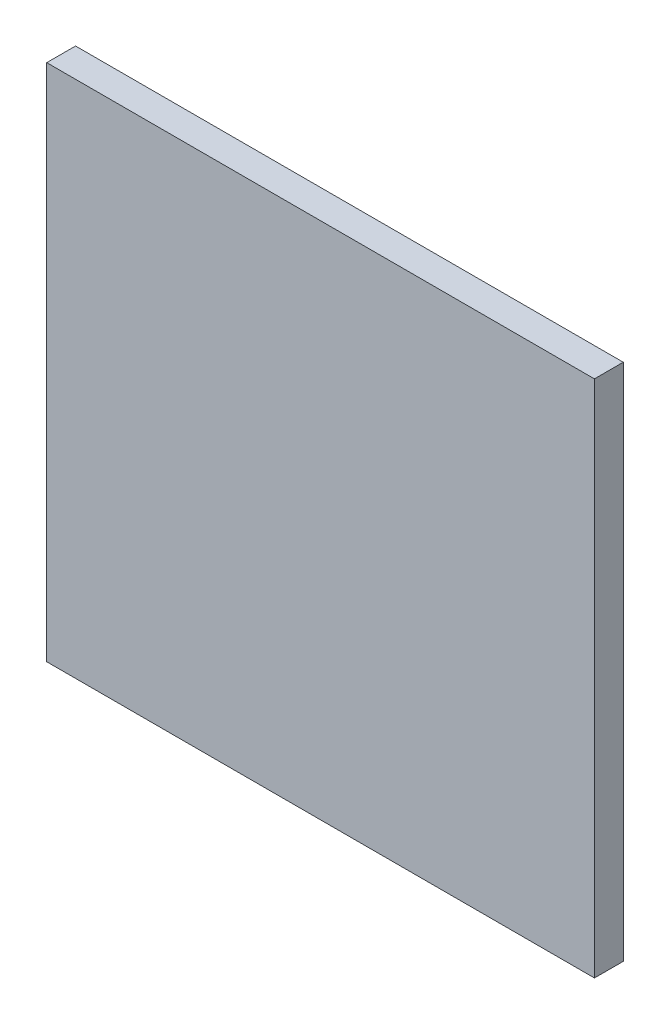
ISO-10303-21;
HEADER;
FILE_DESCRIPTION(('STEP AP214'),'2;1');
FILE_NAME('part.step','',(''),(''),'','','');
FILE_SCHEMA(('AUTOMOTIVE_DESIGN { 1 0 10303 214 1 1 1 1 }'));
ENDSEC;
DATA;
#1=APPLICATION_CONTEXT('core data for automotive mechanical design processes');
#2=APPLICATION_PROTOCOL_DEFINITION('international standard','automotive_design',2000,#1);
#3=PRODUCT_CONTEXT('',#1,'mechanical');
#4=PRODUCT('Part','Part','',(#3));
#5=PRODUCT_RELATED_PRODUCT_CATEGORY('part','',(#4));
#6=PRODUCT_DEFINITION_FORMATION('','',#4);
#7=PRODUCT_DEFINITION_CONTEXT('part definition',#1,'design');
#8=PRODUCT_DEFINITION('design','',#6,#7);
#9=PRODUCT_DEFINITION_SHAPE('','',#8);
#10=(LENGTH_UNIT() NAMED_UNIT(*) SI_UNIT(.MILLI.,.METRE.));
#11=(NAMED_UNIT(*) PLANE_ANGLE_UNIT() SI_UNIT($,.RADIAN.));
#12=(NAMED_UNIT(*) SI_UNIT($,.STERADIAN.) SOLID_ANGLE_UNIT());
#13=UNCERTAINTY_MEASURE_WITH_UNIT(LENGTH_MEASURE(1.E-05),#10,'distance_accuracy_value','');
#14=(GEOMETRIC_REPRESENTATION_CONTEXT(3) GLOBAL_UNCERTAINTY_ASSIGNED_CONTEXT((#13)) GLOBAL_UNIT_ASSIGNED_CONTEXT((#10,
#11,#12)) REPRESENTATION_CONTEXT('',''));
#15=CARTESIAN_POINT('',(0.,0.,0.));
#16=DIRECTION('',(0.,0.,1.));
#17=DIRECTION('',(1.,0.,0.));
#18=AXIS2_PLACEMENT_3D('',#15,#16,#17);
#19=CARTESIAN_POINT('',(0.,-3.6,0.));
#20=DIRECTION('',(0.,0.,1.));
#21=DIRECTION('',(1.,0.,0.));
#22=AXIS2_PLACEMENT_3D('',#19,#20,#21);
#23=PLANE('',#22);
#24=DIRECTION('',(0.,-1.,0.));
#25=VECTOR('',#24,1.);
#26=CARTESIAN_POINT('',(0.7,-3.5,0.));
#27=LINE('',#26,#25);
#28=CARTESIAN_POINT('',(0.7,-3.,0.));
#29=VERTEX_POINT('',#28);
#30=CARTESIAN_POINT('',(0.7,-3.5,0.));
#31=VERTEX_POINT('',#30);
#32=EDGE_CURVE('E263',#29,#31,#27,.T.);
#33=ORIENTED_EDGE('',*,*,#32,.F.);
#34=DIRECTION('',(1.,0.,0.));
#35=VECTOR('',#34,1.);
#36=CARTESIAN_POINT('',(0.7,-3.,0.));
#37=LINE('',#36,#35);
#38=CARTESIAN_POINT('',(0.1,-3.,0.));
#39=VERTEX_POINT('',#38);
#40=EDGE_CURVE('E276',#39,#29,#37,.T.);
#41=ORIENTED_EDGE('',*,*,#40,.F.);
#42=DIRECTION('',(0.,1.,0.));
#43=VECTOR('',#42,1.);
#44=CARTESIAN_POINT('',(0.1,-3.5,0.));
#45=LINE('',#44,#43);
#46=CARTESIAN_POINT('',(0.1,-3.5,0.));
#47=VERTEX_POINT('',#46);
#48=EDGE_CURVE('E285',#47,#39,#45,.T.);
#49=ORIENTED_EDGE('',*,*,#48,.F.);
#50=DIRECTION('',(-1.,0.,0.));
#51=VECTOR('',#50,1.);
#52=CARTESIAN_POINT('',(0.7,-3.5,0.));
#53=LINE('',#52,#51);
#54=EDGE_CURVE('E266',#31,#47,#53,.T.);
#55=ORIENTED_EDGE('',*,*,#54,.F.);
#56=EDGE_LOOP('',(#33,#41,#49,#55));
#57=FACE_BOUND('',#56,.T.);
#58=DIRECTION('',(0.,-1.,0.));
#59=VECTOR('',#58,1.);
#60=CARTESIAN_POINT('',(3.7,-0.6,0.));
#61=LINE('',#60,#59);
#62=CARTESIAN_POINT('',(3.7,-0.0999999999999994,0.));
#63=VERTEX_POINT('',#62);
#64=CARTESIAN_POINT('',(3.7,-0.6,0.));
#65=VERTEX_POINT('',#64);
#66=EDGE_CURVE('E334',#63,#65,#61,.T.);
#67=ORIENTED_EDGE('',*,*,#66,.F.);
#68=DIRECTION('',(1.,0.,0.));
#69=VECTOR('',#68,1.);
#70=CARTESIAN_POINT('',(3.7,-0.0999999999999994,0.));
#71=LINE('',#70,#69);
#72=CARTESIAN_POINT('',(3.1,-0.0999999999999998,0.));
#73=VERTEX_POINT('',#72);
#74=EDGE_CURVE('E339',#73,#63,#71,.T.);
#75=ORIENTED_EDGE('',*,*,#74,.F.);
#76=DIRECTION('',(0.,1.,0.));
#77=VECTOR('',#76,1.);
#78=CARTESIAN_POINT('',(3.1,-0.599999999999999,0.));
#79=LINE('',#78,#77);
#80=CARTESIAN_POINT('',(3.1,-0.599999999999999,0.));
#81=VERTEX_POINT('',#80);
#82=EDGE_CURVE('E351',#81,#73,#79,.T.);
#83=ORIENTED_EDGE('',*,*,#82,.F.);
#84=DIRECTION('',(-1.,0.,0.));
#85=VECTOR('',#84,1.);
#86=CARTESIAN_POINT('',(3.7,-0.6,0.));
#87=LINE('',#86,#85);
#88=EDGE_CURVE('E348',#65,#81,#87,.T.);
#89=ORIENTED_EDGE('',*,*,#88,.F.);
#90=EDGE_LOOP('',(#67,#75,#83,#89));
#91=FACE_BOUND('',#90,.T.);
#92=DIRECTION('',(0.,-1.,0.));
#93=VECTOR('',#92,1.);
#94=CARTESIAN_POINT('',(3.7,-3.,0.));
#95=LINE('',#94,#93);
#96=CARTESIAN_POINT('',(3.7,-3.,0.));
#97=VERTEX_POINT('',#96);
#98=CARTESIAN_POINT('',(3.7,-3.5,0.));
#99=VERTEX_POINT('',#98);
#100=EDGE_CURVE('E400',#97,#99,#95,.T.);
#101=ORIENTED_EDGE('',*,*,#100,.F.);
#102=DIRECTION('',(1.,0.,0.));
#103=VECTOR('',#102,1.);
#104=CARTESIAN_POINT('',(3.7,-3.,0.));
#105=LINE('',#104,#103);
#106=CARTESIAN_POINT('',(3.1,-3.,0.));
#107=VERTEX_POINT('',#106);
#108=EDGE_CURVE('E405',#107,#97,#105,.T.);
#109=ORIENTED_EDGE('',*,*,#108,.F.);
#110=DIRECTION('',(0.,1.,0.));
#111=VECTOR('',#110,1.);
#112=CARTESIAN_POINT('',(3.1,-3.,0.));
#113=LINE('',#112,#111);
#114=CARTESIAN_POINT('',(3.1,-3.5,0.));
#115=VERTEX_POINT('',#114);
#116=EDGE_CURVE('E417',#115,#107,#113,.T.);
#117=ORIENTED_EDGE('',*,*,#116,.F.);
#118=DIRECTION('',(-1.,0.,0.));
#119=VECTOR('',#118,1.);
#120=CARTESIAN_POINT('',(3.7,-3.5,0.));
#121=LINE('',#120,#119);
#122=EDGE_CURVE('E414',#99,#115,#121,.T.);
#123=ORIENTED_EDGE('',*,*,#122,.F.);
#124=EDGE_LOOP('',(#101,#109,#117,#123));
#125=FACE_BOUND('',#124,.T.);
#126=DIRECTION('',(0.,-1.,0.));
#127=VECTOR('',#126,1.);
#128=CARTESIAN_POINT('',(0.,0.,0.));
#129=LINE('',#128,#127);
#130=CARTESIAN_POINT('',(0.,0.,0.));
#131=VERTEX_POINT('',#130);
#132=CARTESIAN_POINT('',(0.,-3.6,0.));
#133=VERTEX_POINT('',#132);
#134=EDGE_CURVE('E466',#131,#133,#129,.T.);
#135=ORIENTED_EDGE('',*,*,#134,.F.);
#136=DIRECTION('',(-1.,0.,0.));
#137=VECTOR('',#136,1.);
#138=CARTESIAN_POINT('',(0.,0.,0.));
#139=LINE('',#138,#137);
#140=CARTESIAN_POINT('',(3.8,0.,0.));
#141=VERTEX_POINT('',#140);
#142=EDGE_CURVE('E471',#141,#131,#139,.T.);
#143=ORIENTED_EDGE('',*,*,#142,.F.);
#144=DIRECTION('',(0.,1.,0.));
#145=VECTOR('',#144,1.);
#146=CARTESIAN_POINT('',(3.8,0.,0.));
#147=LINE('',#146,#145);
#148=CARTESIAN_POINT('',(3.8,-3.6,0.));
#149=VERTEX_POINT('',#148);
#150=EDGE_CURVE('E482',#149,#141,#147,.T.);
#151=ORIENTED_EDGE('',*,*,#150,.F.);
#152=DIRECTION('',(1.,0.,0.));
#153=VECTOR('',#152,1.);
#154=CARTESIAN_POINT('',(0.,-3.6,0.));
#155=LINE('',#154,#153);
#156=EDGE_CURVE('E480',#133,#149,#155,.T.);
#157=ORIENTED_EDGE('',*,*,#156,.F.);
#158=EDGE_LOOP('',(#135,#143,#151,#157));
#159=FACE_BOUND('',#158,.T.);
#160=DIRECTION('',(0.,-1.,0.));
#161=VECTOR('',#160,1.);
#162=CARTESIAN_POINT('',(0.65,-1.5,0.));
#163=LINE('',#162,#161);
#164=CARTESIAN_POINT('',(0.65,-1.5,0.));
#165=VERTEX_POINT('',#164);
#166=CARTESIAN_POINT('',(0.65,-2.1,0.));
#167=VERTEX_POINT('',#166);
#168=EDGE_CURVE('E433',#165,#167,#163,.T.);
#169=ORIENTED_EDGE('',*,*,#168,.F.);
#170=DIRECTION('',(1.,0.,0.));
#171=VECTOR('',#170,1.);
#172=CARTESIAN_POINT('',(0.65,-1.5,0.));
#173=LINE('',#172,#171);
#174=CARTESIAN_POINT('',(0.15,-1.5,0.));
#175=VERTEX_POINT('',#174);
#176=EDGE_CURVE('E438',#175,#165,#173,.T.);
#177=ORIENTED_EDGE('',*,*,#176,.F.);
#178=DIRECTION('',(0.,1.,0.));
#179=VECTOR('',#178,1.);
#180=CARTESIAN_POINT('',(0.15,-1.5,0.));
#181=LINE('',#180,#179);
#182=CARTESIAN_POINT('',(0.15,-2.1,0.));
#183=VERTEX_POINT('',#182);
#184=EDGE_CURVE('E450',#183,#175,#181,.T.);
#185=ORIENTED_EDGE('',*,*,#184,.F.);
#186=DIRECTION('',(-1.,0.,0.));
#187=VECTOR('',#186,1.);
#188=CARTESIAN_POINT('',(0.65,-2.1,0.));
#189=LINE('',#188,#187);
#190=EDGE_CURVE('E447',#167,#183,#189,.T.);
#191=ORIENTED_EDGE('',*,*,#190,.F.);
#192=EDGE_LOOP('',(#169,#177,#185,#191));
#193=FACE_BOUND('',#192,.T.);
#194=DIRECTION('',(0.,-1.,0.));
#195=VECTOR('',#194,1.);
#196=CARTESIAN_POINT('',(2.2,-3.5,0.));
#197=LINE('',#196,#195);
#198=CARTESIAN_POINT('',(2.2,-3.,0.));
#199=VERTEX_POINT('',#198);
#200=CARTESIAN_POINT('',(2.2,-3.5,0.));
#201=VERTEX_POINT('',#200);
#202=EDGE_CURVE('E367',#199,#201,#197,.T.);
#203=ORIENTED_EDGE('',*,*,#202,.F.);
#204=DIRECTION('',(1.,0.,0.));
#205=VECTOR('',#204,1.);
#206=CARTESIAN_POINT('',(2.2,-3.,0.));
#207=LINE('',#206,#205);
#208=CARTESIAN_POINT('',(1.6,-3.,0.));
#209=VERTEX_POINT('',#208);
#210=EDGE_CURVE('E372',#209,#199,#207,.T.);
#211=ORIENTED_EDGE('',*,*,#210,.F.);
#212=DIRECTION('',(0.,1.,0.));
#213=VECTOR('',#212,1.);
#214=CARTESIAN_POINT('',(1.6,-3.5,0.));
#215=LINE('',#214,#213);
#216=CARTESIAN_POINT('',(1.6,-3.5,0.));
#217=VERTEX_POINT('',#216);
#218=EDGE_CURVE('E384',#217,#209,#215,.T.);
#219=ORIENTED_EDGE('',*,*,#218,.F.);
#220=DIRECTION('',(-1.,0.,0.));
#221=VECTOR('',#220,1.);
#222=CARTESIAN_POINT('',(2.2,-3.5,0.));
#223=LINE('',#222,#221);
#224=EDGE_CURVE('E381',#201,#217,#223,.T.);
#225=ORIENTED_EDGE('',*,*,#224,.F.);
#226=EDGE_LOOP('',(#203,#211,#219,#225));
#227=FACE_BOUND('',#226,.T.);
#228=DIRECTION('',(0.,-1.,0.));
#229=VECTOR('',#228,1.);
#230=CARTESIAN_POINT('',(2.2,-0.6,0.));
#231=LINE('',#230,#229);
#232=CARTESIAN_POINT('',(2.2,-0.0999999999999995,0.));
#233=VERTEX_POINT('',#232);
#234=CARTESIAN_POINT('',(2.2,-0.6,0.));
#235=VERTEX_POINT('',#234);
#236=EDGE_CURVE('E301',#233,#235,#231,.T.);
#237=ORIENTED_EDGE('',*,*,#236,.F.);
#238=DIRECTION('',(1.,0.,0.));
#239=VECTOR('',#238,1.);
#240=CARTESIAN_POINT('',(2.2,-0.0999999999999995,0.));
#241=LINE('',#240,#239);
#242=CARTESIAN_POINT('',(1.6,-0.1,0.));
#243=VERTEX_POINT('',#242);
#244=EDGE_CURVE('E306',#243,#233,#241,.T.);
#245=ORIENTED_EDGE('',*,*,#244,.F.);
#246=DIRECTION('',(0.,1.,0.));
#247=VECTOR('',#246,1.);
#248=CARTESIAN_POINT('',(1.6,-0.599999999999999,0.));
#249=LINE('',#248,#247);
#250=CARTESIAN_POINT('',(1.6,-0.599999999999999,0.));
#251=VERTEX_POINT('',#250);
#252=EDGE_CURVE('E318',#251,#243,#249,.T.);
#253=ORIENTED_EDGE('',*,*,#252,.F.);
#254=DIRECTION('',(-1.,0.,0.));
#255=VECTOR('',#254,1.);
#256=CARTESIAN_POINT('',(2.2,-0.6,0.));
#257=LINE('',#256,#255);
#258=EDGE_CURVE('E315',#235,#251,#257,.T.);
#259=ORIENTED_EDGE('',*,*,#258,.F.);
#260=EDGE_LOOP('',(#237,#245,#253,#259));
#261=FACE_BOUND('',#260,.T.);
#262=DIRECTION('',(0.,-1.,0.));
#263=VECTOR('',#262,1.);
#264=CARTESIAN_POINT('',(0.7,-0.6,0.));
#265=LINE('',#264,#263);
#266=CARTESIAN_POINT('',(0.7,-0.0999999999999994,0.));
#267=VERTEX_POINT('',#266);
#268=CARTESIAN_POINT('',(0.7,-0.6,0.));
#269=VERTEX_POINT('',#268);
#270=EDGE_CURVE('E262',#267,#269,#265,.T.);
#271=ORIENTED_EDGE('',*,*,#270,.F.);
#272=DIRECTION('',(1.,0.,0.));
#273=VECTOR('',#272,1.);
#274=CARTESIAN_POINT('',(0.7,-0.0999999999999994,0.));
#275=LINE('',#274,#273);
#276=CARTESIAN_POINT('',(0.100000000000001,-0.0999999999999994,0.));
#277=VERTEX_POINT('',#276);
#278=EDGE_CURVE('E259',#277,#267,#275,.T.);
#279=ORIENTED_EDGE('',*,*,#278,.F.);
#280=DIRECTION('',(0.,1.,0.));
#281=VECTOR('',#280,1.);
#282=CARTESIAN_POINT('',(0.100000000000001,-0.6,0.));
#283=LINE('',#282,#281);
#284=CARTESIAN_POINT('',(0.100000000000001,-0.6,0.));
#285=VERTEX_POINT('',#284);
#286=EDGE_CURVE('E53',#285,#277,#283,.T.);
#287=ORIENTED_EDGE('',*,*,#286,.F.);
#288=DIRECTION('',(-1.,0.,0.));
#289=VECTOR('',#288,1.);
#290=CARTESIAN_POINT('',(0.7,-0.6,0.));
#291=LINE('',#290,#289);
#292=EDGE_CURVE('E48',#269,#285,#291,.T.);
#293=ORIENTED_EDGE('',*,*,#292,.F.);
#294=EDGE_LOOP('',(#271,#279,#287,#293));
#295=FACE_BOUND('',#294,.T.);
#296=ADVANCED_FACE('F33',(#57,#91,#125,#159,#193,#227,#261,#295),#23,.F.);
#297=CARTESIAN_POINT('',(0.,0.,0.2));
#298=DIRECTION('',(1.,0.,0.));
#299=DIRECTION('',(0.,1.,0.));
#300=AXIS2_PLACEMENT_3D('',#297,#298,#299);
#301=PLANE('',#300);
#302=ORIENTED_EDGE('',*,*,#134,.T.);
#303=DIRECTION('',(0.,0.,-1.));
#304=VECTOR('',#303,1.);
#305=CARTESIAN_POINT('',(0.,-3.6,0.2));
#306=LINE('',#305,#304);
#307=CARTESIAN_POINT('',(0.,-3.6,0.2));
#308=VERTEX_POINT('',#307);
#309=EDGE_CURVE('E11',#308,#133,#306,.T.);
#310=ORIENTED_EDGE('',*,*,#309,.F.);
#311=DIRECTION('',(0.,-1.,0.));
#312=VECTOR('',#311,1.);
#313=CARTESIAN_POINT('',(0.,0.,0.2));
#314=LINE('',#313,#312);
#315=CARTESIAN_POINT('',(0.,0.,0.2));
#316=VERTEX_POINT('',#315);
#317=EDGE_CURVE('E467',#316,#308,#314,.T.);
#318=ORIENTED_EDGE('',*,*,#317,.F.);
#319=DIRECTION('',(0.,0.,-1.));
#320=VECTOR('',#319,1.);
#321=CARTESIAN_POINT('',(0.,0.,0.2));
#322=LINE('',#321,#320);
#323=EDGE_CURVE('E477',#316,#131,#322,.T.);
#324=ORIENTED_EDGE('',*,*,#323,.T.);
#325=EDGE_LOOP('',(#302,#310,#318,#324));
#326=FACE_BOUND('',#325,.T.);
#327=ADVANCED_FACE('F35',(#326),#301,.F.);
#328=CARTESIAN_POINT('',(0.,-3.6,0.2));
#329=DIRECTION('',(0.,1.,0.));
#330=DIRECTION('',(0.,0.,1.));
#331=AXIS2_PLACEMENT_3D('',#328,#329,#330);
#332=PLANE('',#331);
#333=ORIENTED_EDGE('',*,*,#156,.T.);
#334=DIRECTION('',(0.,0.,-1.));
#335=VECTOR('',#334,1.);
#336=CARTESIAN_POINT('',(3.8,-3.6,0.2));
#337=LINE('',#336,#335);
#338=CARTESIAN_POINT('',(3.8,-3.6,0.2));
#339=VERTEX_POINT('',#338);
#340=EDGE_CURVE('E41',#339,#149,#337,.T.);
#341=ORIENTED_EDGE('',*,*,#340,.F.);
#342=DIRECTION('',(1.,0.,0.));
#343=VECTOR('',#342,1.);
#344=CARTESIAN_POINT('',(0.,-3.6,0.2));
#345=LINE('',#344,#343);
#346=EDGE_CURVE('E470',#308,#339,#345,.T.);
#347=ORIENTED_EDGE('',*,*,#346,.F.);
#348=ORIENTED_EDGE('',*,*,#309,.T.);
#349=EDGE_LOOP('',(#333,#341,#347,#348));
#350=FACE_BOUND('',#349,.T.);
#351=ADVANCED_FACE('F510',(#350),#332,.F.);
#352=CARTESIAN_POINT('',(3.8,0.,0.2));
#353=DIRECTION('',(-1.,0.,0.));
#354=DIRECTION('',(0.,-1.,0.));
#355=AXIS2_PLACEMENT_3D('',#352,#353,#354);
#356=PLANE('',#355);
#357=ORIENTED_EDGE('',*,*,#150,.T.);
#358=DIRECTION('',(0.,0.,-1.));
#359=VECTOR('',#358,1.);
#360=CARTESIAN_POINT('',(3.8,0.,0.2));
#361=LINE('',#360,#359);
#362=CARTESIAN_POINT('',(3.8,0.,0.2));
#363=VERTEX_POINT('',#362);
#364=EDGE_CURVE('E487',#363,#141,#361,.T.);
#365=ORIENTED_EDGE('',*,*,#364,.F.);
#366=DIRECTION('',(0.,1.,0.));
#367=VECTOR('',#366,1.);
#368=CARTESIAN_POINT('',(3.8,0.,0.2));
#369=LINE('',#368,#367);
#370=EDGE_CURVE('E473',#339,#363,#369,.T.);
#371=ORIENTED_EDGE('',*,*,#370,.F.);
#372=ORIENTED_EDGE('',*,*,#340,.T.);
#373=EDGE_LOOP('',(#357,#365,#371,#372));
#374=FACE_BOUND('',#373,.T.);
#375=ADVANCED_FACE('F494',(#374),#356,.F.);
#376=CARTESIAN_POINT('',(0.,0.,0.2));
#377=DIRECTION('',(0.,-1.,0.));
#378=DIRECTION('',(0.,0.,-1.));
#379=AXIS2_PLACEMENT_3D('',#376,#377,#378);
#380=PLANE('',#379);
#381=ORIENTED_EDGE('',*,*,#142,.T.);
#382=ORIENTED_EDGE('',*,*,#323,.F.);
#383=DIRECTION('',(-1.,0.,0.));
#384=VECTOR('',#383,1.);
#385=CARTESIAN_POINT('',(0.,0.,0.2));
#386=LINE('',#385,#384);
#387=EDGE_CURVE('E475',#363,#316,#386,.T.);
#388=ORIENTED_EDGE('',*,*,#387,.F.);
#389=ORIENTED_EDGE('',*,*,#364,.T.);
#390=EDGE_LOOP('',(#381,#382,#388,#389));
#391=FACE_BOUND('',#390,.T.);
#392=ADVANCED_FACE('F503',(#391),#380,.F.);
#393=CARTESIAN_POINT('',(0.,-3.6,0.2));
#394=DIRECTION('',(0.,0.,1.));
#395=DIRECTION('',(1.,0.,0.));
#396=AXIS2_PLACEMENT_3D('',#393,#394,#395);
#397=PLANE('',#396);
#398=ORIENTED_EDGE('',*,*,#317,.T.);
#399=ORIENTED_EDGE('',*,*,#346,.T.);
#400=ORIENTED_EDGE('',*,*,#370,.T.);
#401=ORIENTED_EDGE('',*,*,#387,.T.);
#402=EDGE_LOOP('',(#398,#399,#400,#401));
#403=FACE_BOUND('',#402,.T.);
#404=ADVANCED_FACE('F509',(#403),#397,.T.);
#405=CARTESIAN_POINT('',(0.65,-1.5,-0.006));
#406=DIRECTION('',(-1.,0.,0.));
#407=DIRECTION('',(0.,0.,1.));
#408=AXIS2_PLACEMENT_3D('',#405,#406,#407);
#409=PLANE('',#408);
#410=ORIENTED_EDGE('',*,*,#168,.T.);
#411=DIRECTION('',(0.,0.,1.));
#412=VECTOR('',#411,1.);
#413=CARTESIAN_POINT('',(0.65,-2.1,-0.006));
#414=LINE('',#413,#412);
#415=CARTESIAN_POINT('',(0.65,-2.1,-0.006));
#416=VERTEX_POINT('',#415);
#417=EDGE_CURVE('E463',#416,#167,#414,.T.);
#418=ORIENTED_EDGE('',*,*,#417,.F.);
#419=DIRECTION('',(0.,-1.,0.));
#420=VECTOR('',#419,1.);
#421=CARTESIAN_POINT('',(0.65,-1.5,-0.006));
#422=LINE('',#421,#420);
#423=CARTESIAN_POINT('',(0.65,-1.5,-0.006));
#424=VERTEX_POINT('',#423);
#425=EDGE_CURVE('E434',#424,#416,#422,.T.);
#426=ORIENTED_EDGE('',*,*,#425,.F.);
#427=DIRECTION('',(0.,0.,1.));
#428=VECTOR('',#427,1.);
#429=CARTESIAN_POINT('',(0.65,-1.5,-0.006));
#430=LINE('',#429,#428);
#431=EDGE_CURVE('E444',#424,#165,#430,.T.);
#432=ORIENTED_EDGE('',*,*,#431,.T.);
#433=EDGE_LOOP('',(#410,#418,#426,#432));
#434=FACE_BOUND('',#433,.T.);
#435=ADVANCED_FACE('F530',(#434),#409,.F.);
#436=CARTESIAN_POINT('',(0.65,-2.1,-0.006));
#437=DIRECTION('',(0.,1.,0.));
#438=DIRECTION('',(-1.,0.,0.));
#439=AXIS2_PLACEMENT_3D('',#436,#437,#438);
#440=PLANE('',#439);
#441=ORIENTED_EDGE('',*,*,#190,.T.);
#442=DIRECTION('',(0.,0.,1.));
#443=VECTOR('',#442,1.);
#444=CARTESIAN_POINT('',(0.15,-2.1,-0.006));
#445=LINE('',#444,#443);
#446=CARTESIAN_POINT('',(0.15,-2.1,-0.006));
#447=VERTEX_POINT('',#446);
#448=EDGE_CURVE('E460',#447,#183,#445,.T.);
#449=ORIENTED_EDGE('',*,*,#448,.F.);
#450=DIRECTION('',(-1.,0.,0.));
#451=VECTOR('',#450,1.);
#452=CARTESIAN_POINT('',(0.65,-2.1,-0.006));
#453=LINE('',#452,#451);
#454=EDGE_CURVE('E437',#416,#447,#453,.T.);
#455=ORIENTED_EDGE('',*,*,#454,.F.);
#456=ORIENTED_EDGE('',*,*,#417,.T.);
#457=EDGE_LOOP('',(#441,#449,#455,#456));
#458=FACE_BOUND('',#457,.T.);
#459=ADVANCED_FACE('F534',(#458),#440,.F.);
#460=CARTESIAN_POINT('',(0.15,-1.5,-0.006));
#461=DIRECTION('',(1.,0.,0.));
#462=DIRECTION('',(0.,0.,-1.));
#463=AXIS2_PLACEMENT_3D('',#460,#461,#462);
#464=PLANE('',#463);
#465=ORIENTED_EDGE('',*,*,#184,.T.);
#466=DIRECTION('',(0.,0.,1.));
#467=VECTOR('',#466,1.);
#468=CARTESIAN_POINT('',(0.15,-1.5,-0.006));
#469=LINE('',#468,#467);
#470=CARTESIAN_POINT('',(0.15,-1.5,-0.006));
#471=VERTEX_POINT('',#470);
#472=EDGE_CURVE('E457',#471,#175,#469,.T.);
#473=ORIENTED_EDGE('',*,*,#472,.F.);
#474=DIRECTION('',(0.,1.,0.));
#475=VECTOR('',#474,1.);
#476=CARTESIAN_POINT('',(0.15,-1.5,-0.006));
#477=LINE('',#476,#475);
#478=EDGE_CURVE('E440',#447,#471,#477,.T.);
#479=ORIENTED_EDGE('',*,*,#478,.F.);
#480=ORIENTED_EDGE('',*,*,#448,.T.);
#481=EDGE_LOOP('',(#465,#473,#479,#480));
#482=FACE_BOUND('',#481,.T.);
#483=ADVANCED_FACE('F539',(#482),#464,.F.);
#484=CARTESIAN_POINT('',(0.65,-1.5,-0.006));
#485=DIRECTION('',(0.,-1.,0.));
#486=DIRECTION('',(0.,0.,-1.));
#487=AXIS2_PLACEMENT_3D('',#484,#485,#486);
#488=PLANE('',#487);
#489=ORIENTED_EDGE('',*,*,#176,.T.);
#490=ORIENTED_EDGE('',*,*,#431,.F.);
#491=DIRECTION('',(1.,0.,0.));
#492=VECTOR('',#491,1.);
#493=CARTESIAN_POINT('',(0.65,-1.5,-0.006));
#494=LINE('',#493,#492);
#495=EDGE_CURVE('E442',#471,#424,#494,.T.);
#496=ORIENTED_EDGE('',*,*,#495,.F.);
#497=ORIENTED_EDGE('',*,*,#472,.T.);
#498=EDGE_LOOP('',(#489,#490,#496,#497));
#499=FACE_BOUND('',#498,.T.);
#500=ADVANCED_FACE('F545',(#499),#488,.F.);
#501=CARTESIAN_POINT('',(0.65,-2.1,-0.006));
#502=DIRECTION('',(0.,0.,-1.));
#503=DIRECTION('',(-1.,0.,0.));
#504=AXIS2_PLACEMENT_3D('',#501,#502,#503);
#505=PLANE('',#504);
#506=ORIENTED_EDGE('',*,*,#425,.T.);
#507=ORIENTED_EDGE('',*,*,#454,.T.);
#508=ORIENTED_EDGE('',*,*,#478,.T.);
#509=ORIENTED_EDGE('',*,*,#495,.T.);
#510=EDGE_LOOP('',(#506,#507,#508,#509));
#511=FACE_BOUND('',#510,.T.);
#512=ADVANCED_FACE('F549',(#511),#505,.T.);
#513=CARTESIAN_POINT('',(3.7,-3.,-0.006));
#514=DIRECTION('',(-1.,0.,0.));
#515=DIRECTION('',(0.,0.,1.));
#516=AXIS2_PLACEMENT_3D('',#513,#514,#515);
#517=PLANE('',#516);
#518=ORIENTED_EDGE('',*,*,#100,.T.);
#519=DIRECTION('',(0.,0.,1.));
#520=VECTOR('',#519,1.);
#521=CARTESIAN_POINT('',(3.7,-3.5,-0.006));
#522=LINE('',#521,#520);
#523=CARTESIAN_POINT('',(3.7,-3.5,-0.006));
#524=VERTEX_POINT('',#523);
#525=EDGE_CURVE('E430',#524,#99,#522,.T.);
#526=ORIENTED_EDGE('',*,*,#525,.F.);
#527=DIRECTION('',(0.,-1.,0.));
#528=VECTOR('',#527,1.);
#529=CARTESIAN_POINT('',(3.7,-3.,-0.006));
#530=LINE('',#529,#528);
#531=CARTESIAN_POINT('',(3.7,-3.,-0.006));
#532=VERTEX_POINT('',#531);
#533=EDGE_CURVE('E401',#532,#524,#530,.T.);
#534=ORIENTED_EDGE('',*,*,#533,.F.);
#535=DIRECTION('',(0.,0.,1.));
#536=VECTOR('',#535,1.);
#537=CARTESIAN_POINT('',(3.7,-3.,-0.006));
#538=LINE('',#537,#536);
#539=EDGE_CURVE('E411',#532,#97,#538,.T.);
#540=ORIENTED_EDGE('',*,*,#539,.T.);
#541=EDGE_LOOP('',(#518,#526,#534,#540));
#542=FACE_BOUND('',#541,.T.);
#543=ADVANCED_FACE('F553',(#542),#517,.F.);
#544=CARTESIAN_POINT('',(3.7,-3.5,-0.006));
#545=DIRECTION('',(0.,1.,0.));
#546=DIRECTION('',(0.,0.,1.));
#547=AXIS2_PLACEMENT_3D('',#544,#545,#546);
#548=PLANE('',#547);
#549=ORIENTED_EDGE('',*,*,#122,.T.);
#550=DIRECTION('',(0.,0.,1.));
#551=VECTOR('',#550,1.);
#552=CARTESIAN_POINT('',(3.1,-3.5,-0.006));
#553=LINE('',#552,#551);
#554=CARTESIAN_POINT('',(3.1,-3.5,-0.006));
#555=VERTEX_POINT('',#554);
#556=EDGE_CURVE('E427',#555,#115,#553,.T.);
#557=ORIENTED_EDGE('',*,*,#556,.F.);
#558=DIRECTION('',(-1.,0.,0.));
#559=VECTOR('',#558,1.);
#560=CARTESIAN_POINT('',(3.7,-3.5,-0.006));
#561=LINE('',#560,#559);
#562=EDGE_CURVE('E404',#524,#555,#561,.T.);
#563=ORIENTED_EDGE('',*,*,#562,.F.);
#564=ORIENTED_EDGE('',*,*,#525,.T.);
#565=EDGE_LOOP('',(#549,#557,#563,#564));
#566=FACE_BOUND('',#565,.T.);
#567=ADVANCED_FACE('F557',(#566),#548,.F.);
#568=CARTESIAN_POINT('',(3.1,-3.,-0.006));
#569=DIRECTION('',(1.,0.,0.));
#570=DIRECTION('',(0.,0.,-1.));
#571=AXIS2_PLACEMENT_3D('',#568,#569,#570);
#572=PLANE('',#571);
#573=ORIENTED_EDGE('',*,*,#116,.T.);
#574=DIRECTION('',(0.,0.,1.));
#575=VECTOR('',#574,1.);
#576=CARTESIAN_POINT('',(3.1,-3.,-0.006));
#577=LINE('',#576,#575);
#578=CARTESIAN_POINT('',(3.1,-3.,-0.006));
#579=VERTEX_POINT('',#578);
#580=EDGE_CURVE('E424',#579,#107,#577,.T.);
#581=ORIENTED_EDGE('',*,*,#580,.F.);
#582=DIRECTION('',(0.,1.,0.));
#583=VECTOR('',#582,1.);
#584=CARTESIAN_POINT('',(3.1,-3.,-0.006));
#585=LINE('',#584,#583);
#586=EDGE_CURVE('E407',#555,#579,#585,.T.);
#587=ORIENTED_EDGE('',*,*,#586,.F.);
#588=ORIENTED_EDGE('',*,*,#556,.T.);
#589=EDGE_LOOP('',(#573,#581,#587,#588));
#590=FACE_BOUND('',#589,.T.);
#591=ADVANCED_FACE('F561',(#590),#572,.F.);
#592=CARTESIAN_POINT('',(3.7,-3.,-0.006));
#593=DIRECTION('',(0.,-1.,0.));
#594=DIRECTION('',(1.,0.,0.));
#595=AXIS2_PLACEMENT_3D('',#592,#593,#594);
#596=PLANE('',#595);
#597=ORIENTED_EDGE('',*,*,#108,.T.);
#598=ORIENTED_EDGE('',*,*,#539,.F.);
#599=DIRECTION('',(1.,0.,0.));
#600=VECTOR('',#599,1.);
#601=CARTESIAN_POINT('',(3.7,-3.,-0.006));
#602=LINE('',#601,#600);
#603=EDGE_CURVE('E409',#579,#532,#602,.T.);
#604=ORIENTED_EDGE('',*,*,#603,.F.);
#605=ORIENTED_EDGE('',*,*,#580,.T.);
#606=EDGE_LOOP('',(#597,#598,#604,#605));
#607=FACE_BOUND('',#606,.T.);
#608=ADVANCED_FACE('F565',(#607),#596,.F.);
#609=CARTESIAN_POINT('',(3.7,-3.5,-0.006));
#610=DIRECTION('',(0.,0.,-1.));
#611=DIRECTION('',(-1.,0.,0.));
#612=AXIS2_PLACEMENT_3D('',#609,#610,#611);
#613=PLANE('',#612);
#614=ORIENTED_EDGE('',*,*,#533,.T.);
#615=ORIENTED_EDGE('',*,*,#562,.T.);
#616=ORIENTED_EDGE('',*,*,#586,.T.);
#617=ORIENTED_EDGE('',*,*,#603,.T.);
#618=EDGE_LOOP('',(#614,#615,#616,#617));
#619=FACE_BOUND('',#618,.T.);
#620=ADVANCED_FACE('F569',(#619),#613,.T.);
#621=CARTESIAN_POINT('',(2.2,-3.5,-0.006));
#622=DIRECTION('',(-1.,0.,0.));
#623=DIRECTION('',(0.,0.,1.));
#624=AXIS2_PLACEMENT_3D('',#621,#622,#623);
#625=PLANE('',#624);
#626=ORIENTED_EDGE('',*,*,#202,.T.);
#627=DIRECTION('',(0.,0.,1.));
#628=VECTOR('',#627,1.);
#629=CARTESIAN_POINT('',(2.2,-3.5,-0.006));
#630=LINE('',#629,#628);
#631=CARTESIAN_POINT('',(2.2,-3.5,-0.006));
#632=VERTEX_POINT('',#631);
#633=EDGE_CURVE('E397',#632,#201,#630,.T.);
#634=ORIENTED_EDGE('',*,*,#633,.F.);
#635=DIRECTION('',(0.,-1.,0.));
#636=VECTOR('',#635,1.);
#637=CARTESIAN_POINT('',(2.2,-3.5,-0.006));
#638=LINE('',#637,#636);
#639=CARTESIAN_POINT('',(2.2,-3.,-0.006));
#640=VERTEX_POINT('',#639);
#641=EDGE_CURVE('E368',#640,#632,#638,.T.);
#642=ORIENTED_EDGE('',*,*,#641,.F.);
#643=DIRECTION('',(0.,0.,1.));
#644=VECTOR('',#643,1.);
#645=CARTESIAN_POINT('',(2.2,-3.,-0.006));
#646=LINE('',#645,#644);
#647=EDGE_CURVE('E378',#640,#199,#646,.T.);
#648=ORIENTED_EDGE('',*,*,#647,.T.);
#649=EDGE_LOOP('',(#626,#634,#642,#648));
#650=FACE_BOUND('',#649,.T.);
#651=ADVANCED_FACE('F573',(#650),#625,.F.);
#652=CARTESIAN_POINT('',(2.2,-3.5,-0.006));
#653=DIRECTION('',(0.,1.,0.));
#654=DIRECTION('',(-1.,0.,0.));
#655=AXIS2_PLACEMENT_3D('',#652,#653,#654);
#656=PLANE('',#655);
#657=ORIENTED_EDGE('',*,*,#224,.T.);
#658=DIRECTION('',(0.,0.,1.));
#659=VECTOR('',#658,1.);
#660=CARTESIAN_POINT('',(1.6,-3.5,-0.006));
#661=LINE('',#660,#659);
#662=CARTESIAN_POINT('',(1.6,-3.5,-0.006));
#663=VERTEX_POINT('',#662);
#664=EDGE_CURVE('E394',#663,#217,#661,.T.);
#665=ORIENTED_EDGE('',*,*,#664,.F.);
#666=DIRECTION('',(-1.,0.,0.));
#667=VECTOR('',#666,1.);
#668=CARTESIAN_POINT('',(2.2,-3.5,-0.006));
#669=LINE('',#668,#667);
#670=EDGE_CURVE('E371',#632,#663,#669,.T.);
#671=ORIENTED_EDGE('',*,*,#670,.F.);
#672=ORIENTED_EDGE('',*,*,#633,.T.);
#673=EDGE_LOOP('',(#657,#665,#671,#672));
#674=FACE_BOUND('',#673,.T.);
#675=ADVANCED_FACE('F577',(#674),#656,.F.);
#676=CARTESIAN_POINT('',(1.6,-3.5,-0.006));
#677=DIRECTION('',(1.,0.,0.));
#678=DIRECTION('',(0.,0.,-1.));
#679=AXIS2_PLACEMENT_3D('',#676,#677,#678);
#680=PLANE('',#679);
#681=ORIENTED_EDGE('',*,*,#218,.T.);
#682=DIRECTION('',(0.,0.,1.));
#683=VECTOR('',#682,1.);
#684=CARTESIAN_POINT('',(1.6,-3.,-0.006));
#685=LINE('',#684,#683);
#686=CARTESIAN_POINT('',(1.6,-3.,-0.006));
#687=VERTEX_POINT('',#686);
#688=EDGE_CURVE('E391',#687,#209,#685,.T.);
#689=ORIENTED_EDGE('',*,*,#688,.F.);
#690=DIRECTION('',(0.,1.,0.));
#691=VECTOR('',#690,1.);
#692=CARTESIAN_POINT('',(1.6,-3.5,-0.006));
#693=LINE('',#692,#691);
#694=EDGE_CURVE('E374',#663,#687,#693,.T.);
#695=ORIENTED_EDGE('',*,*,#694,.F.);
#696=ORIENTED_EDGE('',*,*,#664,.T.);
#697=EDGE_LOOP('',(#681,#689,#695,#696));
#698=FACE_BOUND('',#697,.T.);
#699=ADVANCED_FACE('F581',(#698),#680,.F.);
#700=CARTESIAN_POINT('',(2.2,-3.,-0.006));
#701=DIRECTION('',(0.,-1.,0.));
#702=DIRECTION('',(1.,0.,0.));
#703=AXIS2_PLACEMENT_3D('',#700,#701,#702);
#704=PLANE('',#703);
#705=ORIENTED_EDGE('',*,*,#210,.T.);
#706=ORIENTED_EDGE('',*,*,#647,.F.);
#707=DIRECTION('',(1.,0.,0.));
#708=VECTOR('',#707,1.);
#709=CARTESIAN_POINT('',(2.2,-3.,-0.006));
#710=LINE('',#709,#708);
#711=EDGE_CURVE('E376',#687,#640,#710,.T.);
#712=ORIENTED_EDGE('',*,*,#711,.F.);
#713=ORIENTED_EDGE('',*,*,#688,.T.);
#714=EDGE_LOOP('',(#705,#706,#712,#713));
#715=FACE_BOUND('',#714,.T.);
#716=ADVANCED_FACE('F585',(#715),#704,.F.);
#717=CARTESIAN_POINT('',(2.2,-3.,-0.006));
#718=DIRECTION('',(0.,0.,1.));
#719=DIRECTION('',(1.,0.,0.));
#720=AXIS2_PLACEMENT_3D('',#717,#718,#719);
#721=PLANE('',#720);
#722=ORIENTED_EDGE('',*,*,#641,.T.);
#723=ORIENTED_EDGE('',*,*,#670,.T.);
#724=ORIENTED_EDGE('',*,*,#694,.T.);
#725=ORIENTED_EDGE('',*,*,#711,.T.);
#726=EDGE_LOOP('',(#722,#723,#724,#725));
#727=FACE_BOUND('',#726,.T.);
#728=ADVANCED_FACE('F589',(#727),#721,.F.);
#729=CARTESIAN_POINT('',(3.7,-0.6,-0.006));
#730=DIRECTION('',(-1.,0.,0.));
#731=DIRECTION('',(0.,0.,1.));
#732=AXIS2_PLACEMENT_3D('',#729,#730,#731);
#733=PLANE('',#732);
#734=ORIENTED_EDGE('',*,*,#66,.T.);
#735=DIRECTION('',(0.,0.,1.));
#736=VECTOR('',#735,1.);
#737=CARTESIAN_POINT('',(3.7,-0.6,-0.006));
#738=LINE('',#737,#736);
#739=CARTESIAN_POINT('',(3.7,-0.6,-0.006));
#740=VERTEX_POINT('',#739);
#741=EDGE_CURVE('E364',#740,#65,#738,.T.);
#742=ORIENTED_EDGE('',*,*,#741,.F.);
#743=DIRECTION('',(0.,-1.,0.));
#744=VECTOR('',#743,1.);
#745=CARTESIAN_POINT('',(3.7,-0.6,-0.006));
#746=LINE('',#745,#744);
#747=CARTESIAN_POINT('',(3.7,-0.0999999999999994,-0.006));
#748=VERTEX_POINT('',#747);
#749=EDGE_CURVE('E335',#748,#740,#746,.T.);
#750=ORIENTED_EDGE('',*,*,#749,.F.);
#751=DIRECTION('',(0.,0.,1.));
#752=VECTOR('',#751,1.);
#753=CARTESIAN_POINT('',(3.7,-0.0999999999999994,-0.006));
#754=LINE('',#753,#752);
#755=EDGE_CURVE('E345',#748,#63,#754,.T.);
#756=ORIENTED_EDGE('',*,*,#755,.T.);
#757=EDGE_LOOP('',(#734,#742,#750,#756));
#758=FACE_BOUND('',#757,.T.);
#759=ADVANCED_FACE('F593',(#758),#733,.F.);
#760=CARTESIAN_POINT('',(3.7,-0.6,-0.006));
#761=DIRECTION('',(0.,1.,0.));
#762=DIRECTION('',(-1.,0.,0.));
#763=AXIS2_PLACEMENT_3D('',#760,#761,#762);
#764=PLANE('',#763);
#765=ORIENTED_EDGE('',*,*,#88,.T.);
#766=DIRECTION('',(0.,0.,1.));
#767=VECTOR('',#766,1.);
#768=CARTESIAN_POINT('',(3.1,-0.599999999999999,-0.006));
#769=LINE('',#768,#767);
#770=CARTESIAN_POINT('',(3.1,-0.599999999999999,-0.006));
#771=VERTEX_POINT('',#770);
#772=EDGE_CURVE('E361',#771,#81,#769,.T.);
#773=ORIENTED_EDGE('',*,*,#772,.F.);
#774=DIRECTION('',(-1.,0.,0.));
#775=VECTOR('',#774,1.);
#776=CARTESIAN_POINT('',(3.7,-0.6,-0.006));
#777=LINE('',#776,#775);
#778=EDGE_CURVE('E338',#740,#771,#777,.T.);
#779=ORIENTED_EDGE('',*,*,#778,.F.);
#780=ORIENTED_EDGE('',*,*,#741,.T.);
#781=EDGE_LOOP('',(#765,#773,#779,#780));
#782=FACE_BOUND('',#781,.T.);
#783=ADVANCED_FACE('F597',(#782),#764,.F.);
#784=CARTESIAN_POINT('',(3.1,-0.599999999999999,-0.006));
#785=DIRECTION('',(1.,0.,0.));
#786=DIRECTION('',(0.,0.,-1.));
#787=AXIS2_PLACEMENT_3D('',#784,#785,#786);
#788=PLANE('',#787);
#789=ORIENTED_EDGE('',*,*,#82,.T.);
#790=DIRECTION('',(0.,0.,1.));
#791=VECTOR('',#790,1.);
#792=CARTESIAN_POINT('',(3.1,-0.0999999999999998,-0.006));
#793=LINE('',#792,#791);
#794=CARTESIAN_POINT('',(3.1,-0.0999999999999998,-0.006));
#795=VERTEX_POINT('',#794);
#796=EDGE_CURVE('E358',#795,#73,#793,.T.);
#797=ORIENTED_EDGE('',*,*,#796,.F.);
#798=DIRECTION('',(0.,1.,0.));
#799=VECTOR('',#798,1.);
#800=CARTESIAN_POINT('',(3.1,-0.599999999999999,-0.006));
#801=LINE('',#800,#799);
#802=EDGE_CURVE('E341',#771,#795,#801,.T.);
#803=ORIENTED_EDGE('',*,*,#802,.F.);
#804=ORIENTED_EDGE('',*,*,#772,.T.);
#805=EDGE_LOOP('',(#789,#797,#803,#804));
#806=FACE_BOUND('',#805,.T.);
#807=ADVANCED_FACE('F601',(#806),#788,.F.);
#808=CARTESIAN_POINT('',(3.7,-0.0999999999999994,-0.006));
#809=DIRECTION('',(0.,-1.,0.));
#810=DIRECTION('',(1.,0.,0.));
#811=AXIS2_PLACEMENT_3D('',#808,#809,#810);
#812=PLANE('',#811);
#813=ORIENTED_EDGE('',*,*,#74,.T.);
#814=ORIENTED_EDGE('',*,*,#755,.F.);
#815=DIRECTION('',(1.,0.,0.));
#816=VECTOR('',#815,1.);
#817=CARTESIAN_POINT('',(3.7,-0.0999999999999994,-0.006));
#818=LINE('',#817,#816);
#819=EDGE_CURVE('E343',#795,#748,#818,.T.);
#820=ORIENTED_EDGE('',*,*,#819,.F.);
#821=ORIENTED_EDGE('',*,*,#796,.T.);
#822=EDGE_LOOP('',(#813,#814,#820,#821));
#823=FACE_BOUND('',#822,.T.);
#824=ADVANCED_FACE('F605',(#823),#812,.F.);
#825=CARTESIAN_POINT('',(3.7,-0.0999999999999994,-0.006));
#826=DIRECTION('',(0.,0.,1.));
#827=DIRECTION('',(1.,0.,0.));
#828=AXIS2_PLACEMENT_3D('',#825,#826,#827);
#829=PLANE('',#828);
#830=ORIENTED_EDGE('',*,*,#749,.T.);
#831=ORIENTED_EDGE('',*,*,#778,.T.);
#832=ORIENTED_EDGE('',*,*,#802,.T.);
#833=ORIENTED_EDGE('',*,*,#819,.T.);
#834=EDGE_LOOP('',(#830,#831,#832,#833));
#835=FACE_BOUND('',#834,.T.);
#836=ADVANCED_FACE('F609',(#835),#829,.F.);
#837=CARTESIAN_POINT('',(2.2,-0.6,-0.006));
#838=DIRECTION('',(-1.,0.,0.));
#839=DIRECTION('',(0.,0.,1.));
#840=AXIS2_PLACEMENT_3D('',#837,#838,#839);
#841=PLANE('',#840);
#842=ORIENTED_EDGE('',*,*,#236,.T.);
#843=DIRECTION('',(0.,0.,1.));
#844=VECTOR('',#843,1.);
#845=CARTESIAN_POINT('',(2.2,-0.6,-0.006));
#846=LINE('',#845,#844);
#847=CARTESIAN_POINT('',(2.2,-0.6,-0.006));
#848=VERTEX_POINT('',#847);
#849=EDGE_CURVE('E331',#848,#235,#846,.T.);
#850=ORIENTED_EDGE('',*,*,#849,.F.);
#851=DIRECTION('',(0.,-1.,0.));
#852=VECTOR('',#851,1.);
#853=CARTESIAN_POINT('',(2.2,-0.6,-0.006));
#854=LINE('',#853,#852);
#855=CARTESIAN_POINT('',(2.2,-0.0999999999999995,-0.006));
#856=VERTEX_POINT('',#855);
#857=EDGE_CURVE('E302',#856,#848,#854,.T.);
#858=ORIENTED_EDGE('',*,*,#857,.F.);
#859=DIRECTION('',(0.,0.,1.));
#860=VECTOR('',#859,1.);
#861=CARTESIAN_POINT('',(2.2,-0.0999999999999995,-0.006));
#862=LINE('',#861,#860);
#863=EDGE_CURVE('E312',#856,#233,#862,.T.);
#864=ORIENTED_EDGE('',*,*,#863,.T.);
#865=EDGE_LOOP('',(#842,#850,#858,#864));
#866=FACE_BOUND('',#865,.T.);
#867=ADVANCED_FACE('F613',(#866),#841,.F.);
#868=CARTESIAN_POINT('',(2.2,-0.6,-0.006));
#869=DIRECTION('',(0.,1.,0.));
#870=DIRECTION('',(-1.,0.,0.));
#871=AXIS2_PLACEMENT_3D('',#868,#869,#870);
#872=PLANE('',#871);
#873=ORIENTED_EDGE('',*,*,#258,.T.);
#874=DIRECTION('',(0.,0.,1.));
#875=VECTOR('',#874,1.);
#876=CARTESIAN_POINT('',(1.6,-0.599999999999999,-0.006));
#877=LINE('',#876,#875);
#878=CARTESIAN_POINT('',(1.6,-0.599999999999999,-0.006));
#879=VERTEX_POINT('',#878);
#880=EDGE_CURVE('E328',#879,#251,#877,.T.);
#881=ORIENTED_EDGE('',*,*,#880,.F.);
#882=DIRECTION('',(-1.,0.,0.));
#883=VECTOR('',#882,1.);
#884=CARTESIAN_POINT('',(2.2,-0.6,-0.006));
#885=LINE('',#884,#883);
#886=EDGE_CURVE('E305',#848,#879,#885,.T.);
#887=ORIENTED_EDGE('',*,*,#886,.F.);
#888=ORIENTED_EDGE('',*,*,#849,.T.);
#889=EDGE_LOOP('',(#873,#881,#887,#888));
#890=FACE_BOUND('',#889,.T.);
#891=ADVANCED_FACE('F617',(#890),#872,.F.);
#892=CARTESIAN_POINT('',(1.6,-0.599999999999999,-0.006));
#893=DIRECTION('',(1.,0.,0.));
#894=DIRECTION('',(0.,0.,-1.));
#895=AXIS2_PLACEMENT_3D('',#892,#893,#894);
#896=PLANE('',#895);
#897=ORIENTED_EDGE('',*,*,#252,.T.);
#898=DIRECTION('',(0.,0.,1.));
#899=VECTOR('',#898,1.);
#900=CARTESIAN_POINT('',(1.6,-0.0999999999999999,-0.006));
#901=LINE('',#900,#899);
#902=CARTESIAN_POINT('',(1.6,-0.0999999999999999,-0.006));
#903=VERTEX_POINT('',#902);
#904=EDGE_CURVE('E325',#903,#243,#901,.T.);
#905=ORIENTED_EDGE('',*,*,#904,.F.);
#906=DIRECTION('',(0.,1.,0.));
#907=VECTOR('',#906,1.);
#908=CARTESIAN_POINT('',(1.6,-0.599999999999999,-0.006));
#909=LINE('',#908,#907);
#910=EDGE_CURVE('E308',#879,#903,#909,.T.);
#911=ORIENTED_EDGE('',*,*,#910,.F.);
#912=ORIENTED_EDGE('',*,*,#880,.T.);
#913=EDGE_LOOP('',(#897,#905,#911,#912));
#914=FACE_BOUND('',#913,.T.);
#915=ADVANCED_FACE('F621',(#914),#896,.F.);
#916=CARTESIAN_POINT('',(2.2,-0.0999999999999995,-0.006));
#917=DIRECTION('',(0.,-1.,0.));
#918=DIRECTION('',(1.,0.,0.));
#919=AXIS2_PLACEMENT_3D('',#916,#917,#918);
#920=PLANE('',#919);
#921=ORIENTED_EDGE('',*,*,#244,.T.);
#922=ORIENTED_EDGE('',*,*,#863,.F.);
#923=DIRECTION('',(1.,0.,0.));
#924=VECTOR('',#923,1.);
#925=CARTESIAN_POINT('',(2.2,-0.0999999999999995,-0.006));
#926=LINE('',#925,#924);
#927=EDGE_CURVE('E310',#903,#856,#926,.T.);
#928=ORIENTED_EDGE('',*,*,#927,.F.);
#929=ORIENTED_EDGE('',*,*,#904,.T.);
#930=EDGE_LOOP('',(#921,#922,#928,#929));
#931=FACE_BOUND('',#930,.T.);
#932=ADVANCED_FACE('F625',(#931),#920,.F.);
#933=CARTESIAN_POINT('',(2.2,-0.0999999999999995,-0.006));
#934=DIRECTION('',(0.,0.,1.));
#935=DIRECTION('',(1.,0.,0.));
#936=AXIS2_PLACEMENT_3D('',#933,#934,#935);
#937=PLANE('',#936);
#938=ORIENTED_EDGE('',*,*,#857,.T.);
#939=ORIENTED_EDGE('',*,*,#886,.T.);
#940=ORIENTED_EDGE('',*,*,#910,.T.);
#941=ORIENTED_EDGE('',*,*,#927,.T.);
#942=EDGE_LOOP('',(#938,#939,#940,#941));
#943=FACE_BOUND('',#942,.T.);
#944=ADVANCED_FACE('F629',(#943),#937,.F.);
#945=CARTESIAN_POINT('',(0.7,-3.5,-0.006));
#946=DIRECTION('',(-1.,0.,0.));
#947=DIRECTION('',(0.,0.,1.));
#948=AXIS2_PLACEMENT_3D('',#945,#946,#947);
#949=PLANE('',#948);
#950=ORIENTED_EDGE('',*,*,#32,.T.);
#951=DIRECTION('',(0.,0.,1.));
#952=VECTOR('',#951,1.);
#953=CARTESIAN_POINT('',(0.7,-3.5,-0.006));
#954=LINE('',#953,#952);
#955=CARTESIAN_POINT('',(0.7,-3.5,-0.006));
#956=VERTEX_POINT('',#955);
#957=EDGE_CURVE('E298',#956,#31,#954,.T.);
#958=ORIENTED_EDGE('',*,*,#957,.F.);
#959=DIRECTION('',(0.,-1.,0.));
#960=VECTOR('',#959,1.);
#961=CARTESIAN_POINT('',(0.7,-3.5,-0.006));
#962=LINE('',#961,#960);
#963=CARTESIAN_POINT('',(0.7,-3.,-0.006));
#964=VERTEX_POINT('',#963);
#965=EDGE_CURVE('E272',#964,#956,#962,.T.);
#966=ORIENTED_EDGE('',*,*,#965,.F.);
#967=DIRECTION('',(0.,0.,1.));
#968=VECTOR('',#967,1.);
#969=CARTESIAN_POINT('',(0.7,-3.,-0.006));
#970=LINE('',#969,#968);
#971=EDGE_CURVE('E281',#964,#29,#970,.T.);
#972=ORIENTED_EDGE('',*,*,#971,.T.);
#973=EDGE_LOOP('',(#950,#958,#966,#972));
#974=FACE_BOUND('',#973,.T.);
#975=ADVANCED_FACE('F633',(#974),#949,.F.);
#976=CARTESIAN_POINT('',(0.7,-3.5,-0.006));
#977=DIRECTION('',(0.,1.,0.));
#978=DIRECTION('',(-1.,0.,0.));
#979=AXIS2_PLACEMENT_3D('',#976,#977,#978);
#980=PLANE('',#979);
#981=ORIENTED_EDGE('',*,*,#54,.T.);
#982=DIRECTION('',(0.,0.,1.));
#983=VECTOR('',#982,1.);
#984=CARTESIAN_POINT('',(0.1,-3.5,-0.006));
#985=LINE('',#984,#983);
#986=CARTESIAN_POINT('',(0.1,-3.5,-0.006));
#987=VERTEX_POINT('',#986);
#988=EDGE_CURVE('E295',#987,#47,#985,.T.);
#989=ORIENTED_EDGE('',*,*,#988,.F.);
#990=DIRECTION('',(-1.,0.,0.));
#991=VECTOR('',#990,1.);
#992=CARTESIAN_POINT('',(0.7,-3.5,-0.006));
#993=LINE('',#992,#991);
#994=EDGE_CURVE('E275',#956,#987,#993,.T.);
#995=ORIENTED_EDGE('',*,*,#994,.F.);
#996=ORIENTED_EDGE('',*,*,#957,.T.);
#997=EDGE_LOOP('',(#981,#989,#995,#996));
#998=FACE_BOUND('',#997,.T.);
#999=ADVANCED_FACE('F637',(#998),#980,.F.);
#1000=CARTESIAN_POINT('',(0.1,-3.5,-0.006));
#1001=DIRECTION('',(1.,0.,0.));
#1002=DIRECTION('',(0.,0.,-1.));
#1003=AXIS2_PLACEMENT_3D('',#1000,#1001,#1002);
#1004=PLANE('',#1003);
#1005=ORIENTED_EDGE('',*,*,#48,.T.);
#1006=DIRECTION('',(0.,0.,1.));
#1007=VECTOR('',#1006,1.);
#1008=CARTESIAN_POINT('',(0.1,-3.,-0.006));
#1009=LINE('',#1008,#1007);
#1010=CARTESIAN_POINT('',(0.1,-3.,-0.006));
#1011=VERTEX_POINT('',#1010);
#1012=EDGE_CURVE('E292',#1011,#39,#1009,.T.);
#1013=ORIENTED_EDGE('',*,*,#1012,.F.);
#1014=DIRECTION('',(0.,1.,0.));
#1015=VECTOR('',#1014,1.);
#1016=CARTESIAN_POINT('',(0.1,-3.5,-0.006));
#1017=LINE('',#1016,#1015);
#1018=EDGE_CURVE('E278',#987,#1011,#1017,.T.);
#1019=ORIENTED_EDGE('',*,*,#1018,.F.);
#1020=ORIENTED_EDGE('',*,*,#988,.T.);
#1021=EDGE_LOOP('',(#1005,#1013,#1019,#1020));
#1022=FACE_BOUND('',#1021,.T.);
#1023=ADVANCED_FACE('F641',(#1022),#1004,.F.);
#1024=CARTESIAN_POINT('',(0.7,-3.,-0.006));
#1025=DIRECTION('',(0.,-1.,0.));
#1026=DIRECTION('',(1.,0.,0.));
#1027=AXIS2_PLACEMENT_3D('',#1024,#1025,#1026);
#1028=PLANE('',#1027);
#1029=ORIENTED_EDGE('',*,*,#40,.T.);
#1030=ORIENTED_EDGE('',*,*,#971,.F.);
#1031=DIRECTION('',(1.,0.,0.));
#1032=VECTOR('',#1031,1.);
#1033=CARTESIAN_POINT('',(0.7,-3.,-0.006));
#1034=LINE('',#1033,#1032);
#1035=EDGE_CURVE('E280',#1011,#964,#1034,.T.);
#1036=ORIENTED_EDGE('',*,*,#1035,.F.);
#1037=ORIENTED_EDGE('',*,*,#1012,.T.);
#1038=EDGE_LOOP('',(#1029,#1030,#1036,#1037));
#1039=FACE_BOUND('',#1038,.T.);
#1040=ADVANCED_FACE('F645',(#1039),#1028,.F.);
#1041=CARTESIAN_POINT('',(0.7,-3.,-0.006));
#1042=DIRECTION('',(0.,0.,1.));
#1043=DIRECTION('',(1.,0.,0.));
#1044=AXIS2_PLACEMENT_3D('',#1041,#1042,#1043);
#1045=PLANE('',#1044);
#1046=ORIENTED_EDGE('',*,*,#965,.T.);
#1047=ORIENTED_EDGE('',*,*,#994,.T.);
#1048=ORIENTED_EDGE('',*,*,#1018,.T.);
#1049=ORIENTED_EDGE('',*,*,#1035,.T.);
#1050=EDGE_LOOP('',(#1046,#1047,#1048,#1049));
#1051=FACE_BOUND('',#1050,.T.);
#1052=ADVANCED_FACE('F649',(#1051),#1045,.F.);
#1053=CARTESIAN_POINT('',(0.7,-0.6,-0.006));
#1054=DIRECTION('',(-1.,0.,0.));
#1055=DIRECTION('',(0.,0.,1.));
#1056=AXIS2_PLACEMENT_3D('',#1053,#1054,#1055);
#1057=PLANE('',#1056);
#1058=ORIENTED_EDGE('',*,*,#270,.T.);
#1059=DIRECTION('',(0.,0.,1.));
#1060=VECTOR('',#1059,1.);
#1061=CARTESIAN_POINT('',(0.7,-0.6,-0.006));
#1062=LINE('',#1061,#1060);
#1063=CARTESIAN_POINT('',(0.7,-0.6,-0.006));
#1064=VERTEX_POINT('',#1063);
#1065=EDGE_CURVE('E243',#1064,#269,#1062,.T.);
#1066=ORIENTED_EDGE('',*,*,#1065,.F.);
#1067=DIRECTION('',(0.,-1.,0.));
#1068=VECTOR('',#1067,1.);
#1069=CARTESIAN_POINT('',(0.7,-0.6,-0.006));
#1070=LINE('',#1069,#1068);
#1071=CARTESIAN_POINT('',(0.7,-0.0999999999999994,-0.006));
#1072=VERTEX_POINT('',#1071);
#1073=EDGE_CURVE('E250',#1072,#1064,#1070,.T.);
#1074=ORIENTED_EDGE('',*,*,#1073,.F.);
#1075=DIRECTION('',(0.,0.,1.));
#1076=VECTOR('',#1075,1.);
#1077=CARTESIAN_POINT('',(0.7,-0.0999999999999994,-0.006));
#1078=LINE('',#1077,#1076);
#1079=EDGE_CURVE('E905',#1072,#267,#1078,.T.);
#1080=ORIENTED_EDGE('',*,*,#1079,.T.);
#1081=EDGE_LOOP('',(#1058,#1066,#1074,#1080));
#1082=FACE_BOUND('',#1081,.T.);
#1083=ADVANCED_FACE('F261',(#1082),#1057,.F.);
#1084=CARTESIAN_POINT('',(0.7,-0.6,-0.006));
#1085=DIRECTION('',(0.,1.,0.));
#1086=DIRECTION('',(0.,0.,1.));
#1087=AXIS2_PLACEMENT_3D('',#1084,#1085,#1086);
#1088=PLANE('',#1087);
#1089=ORIENTED_EDGE('',*,*,#292,.T.);
#1090=DIRECTION('',(0.,0.,1.));
#1091=VECTOR('',#1090,1.);
#1092=CARTESIAN_POINT('',(0.100000000000001,-0.6,-0.006));
#1093=LINE('',#1092,#1091);
#1094=CARTESIAN_POINT('',(0.100000000000001,-0.6,-0.006));
#1095=VERTEX_POINT('',#1094);
#1096=EDGE_CURVE('E246',#1095,#285,#1093,.T.);
#1097=ORIENTED_EDGE('',*,*,#1096,.F.);
#1098=DIRECTION('',(-1.,0.,0.));
#1099=VECTOR('',#1098,1.);
#1100=CARTESIAN_POINT('',(0.7,-0.6,-0.006));
#1101=LINE('',#1100,#1099);
#1102=EDGE_CURVE('E239',#1064,#1095,#1101,.T.);
#1103=ORIENTED_EDGE('',*,*,#1102,.F.);
#1104=ORIENTED_EDGE('',*,*,#1065,.T.);
#1105=EDGE_LOOP('',(#1089,#1097,#1103,#1104));
#1106=FACE_BOUND('',#1105,.T.);
#1107=ADVANCED_FACE('F241',(#1106),#1088,.F.);
#1108=CARTESIAN_POINT('',(0.100000000000001,-0.6,-0.006));
#1109=DIRECTION('',(1.,0.,0.));
#1110=DIRECTION('',(0.,1.,0.));
#1111=AXIS2_PLACEMENT_3D('',#1108,#1109,#1110);
#1112=PLANE('',#1111);
#1113=ORIENTED_EDGE('',*,*,#286,.T.);
#1114=DIRECTION('',(0.,0.,1.));
#1115=VECTOR('',#1114,1.);
#1116=CARTESIAN_POINT('',(0.100000000000001,-0.0999999999999993,-0.006));
#1117=LINE('',#1116,#1115);
#1118=CARTESIAN_POINT('',(0.100000000000001,-0.0999999999999993,-0.006));
#1119=VERTEX_POINT('',#1118);
#1120=EDGE_CURVE('E268',#1119,#277,#1117,.T.);
#1121=ORIENTED_EDGE('',*,*,#1120,.F.);
#1122=DIRECTION('',(0.,1.,0.));
#1123=VECTOR('',#1122,1.);
#1124=CARTESIAN_POINT('',(0.100000000000001,-0.6,-0.006));
#1125=LINE('',#1124,#1123);
#1126=EDGE_CURVE('E249',#1095,#1119,#1125,.T.);
#1127=ORIENTED_EDGE('',*,*,#1126,.F.);
#1128=ORIENTED_EDGE('',*,*,#1096,.T.);
#1129=EDGE_LOOP('',(#1113,#1121,#1127,#1128));
#1130=FACE_BOUND('',#1129,.T.);
#1131=ADVANCED_FACE('F658',(#1130),#1112,.F.);
#1132=CARTESIAN_POINT('',(0.7,-0.0999999999999994,-0.006));
#1133=DIRECTION('',(0.,-1.,0.));
#1134=DIRECTION('',(1.,0.,0.));
#1135=AXIS2_PLACEMENT_3D('',#1132,#1133,#1134);
#1136=PLANE('',#1135);
#1137=ORIENTED_EDGE('',*,*,#278,.T.);
#1138=ORIENTED_EDGE('',*,*,#1079,.F.);
#1139=DIRECTION('',(1.,0.,0.));
#1140=VECTOR('',#1139,1.);
#1141=CARTESIAN_POINT('',(0.7,-0.0999999999999994,-0.006));
#1142=LINE('',#1141,#1140);
#1143=EDGE_CURVE('E255',#1119,#1072,#1142,.T.);
#1144=ORIENTED_EDGE('',*,*,#1143,.F.);
#1145=ORIENTED_EDGE('',*,*,#1120,.T.);
#1146=EDGE_LOOP('',(#1137,#1138,#1144,#1145));
#1147=FACE_BOUND('',#1146,.T.);
#1148=ADVANCED_FACE('F661',(#1147),#1136,.F.);
#1149=CARTESIAN_POINT('',(0.7,-0.0999999999999994,-0.006));
#1150=DIRECTION('',(0.,0.,1.));
#1151=DIRECTION('',(1.,0.,0.));
#1152=AXIS2_PLACEMENT_3D('',#1149,#1150,#1151);
#1153=PLANE('',#1152);
#1154=ORIENTED_EDGE('',*,*,#1073,.T.);
#1155=ORIENTED_EDGE('',*,*,#1102,.T.);
#1156=ORIENTED_EDGE('',*,*,#1126,.T.);
#1157=ORIENTED_EDGE('',*,*,#1143,.T.);
#1158=EDGE_LOOP('',(#1154,#1155,#1156,#1157));
#1159=FACE_BOUND('',#1158,.T.);
#1160=ADVANCED_FACE('F253',(#1159),#1153,.F.);
#1161=CLOSED_SHELL('',(#296,#327,#351,#375,#392,#404,#435,#459,#483,#500,#512,#543,#567,#591,
#608,#620,#651,#675,#699,#716,#728,#759,#783,#807,#824,#836,#867,#891,#915,#932,#944,#975,#999,
#1023,#1040,#1052,#1083,#1107,#1131,#1148,#1160));
#1162=MANIFOLD_SOLID_BREP('B2',#1161);
#1163=ADVANCED_BREP_SHAPE_REPRESENTATION('',(#18,#1162),#14);
#1164=SHAPE_DEFINITION_REPRESENTATION(#9,#1163);
ENDSEC;
END-ISO-10303-21;
